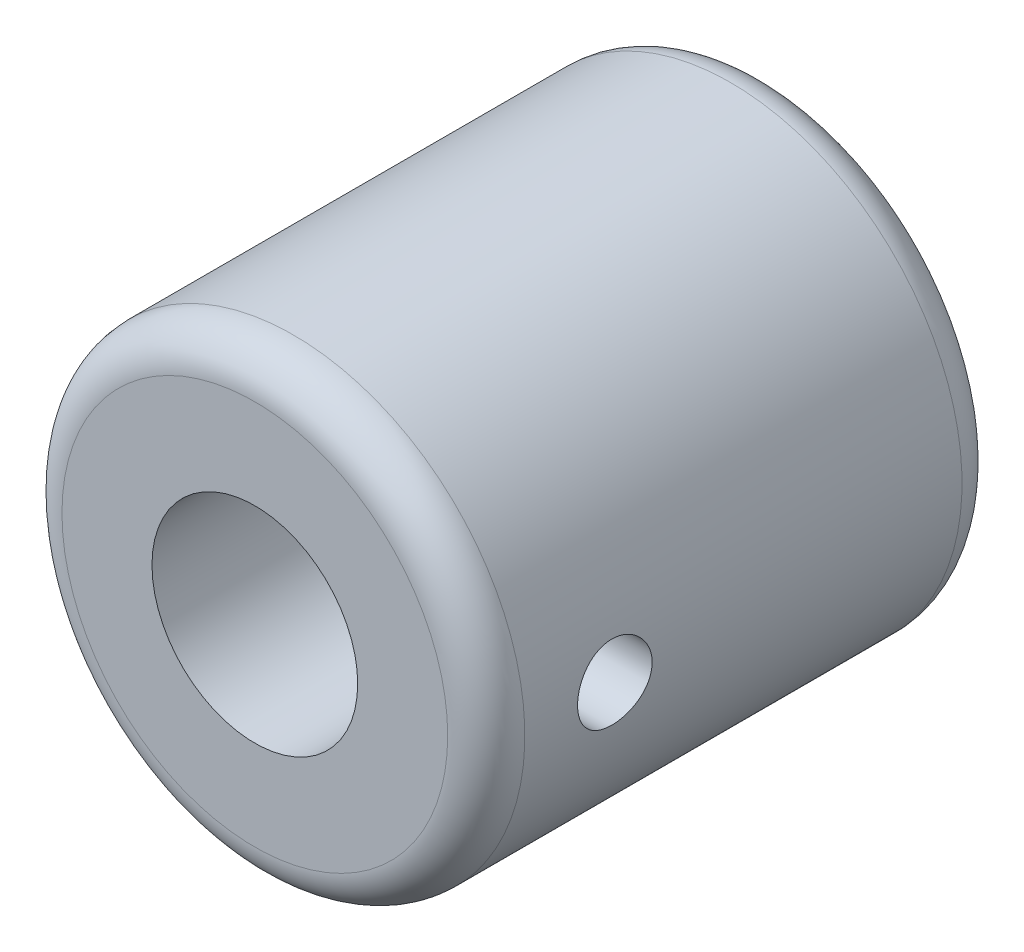
ISO-10303-21;
HEADER;
FILE_DESCRIPTION(('STEP AP214'),'2;1');
FILE_NAME('part.step','',(''),(''),'','','');
FILE_SCHEMA(('AUTOMOTIVE_DESIGN { 1 0 10303 214 1 1 1 1 }'));
ENDSEC;
DATA;
#1=APPLICATION_CONTEXT('core data for automotive mechanical design processes');
#2=APPLICATION_PROTOCOL_DEFINITION('international standard','automotive_design',2000,#1);
#3=PRODUCT_CONTEXT('',#1,'mechanical');
#4=PRODUCT('Part','Part','',(#3));
#5=PRODUCT_RELATED_PRODUCT_CATEGORY('part','',(#4));
#6=PRODUCT_DEFINITION_FORMATION('','',#4);
#7=PRODUCT_DEFINITION_CONTEXT('part definition',#1,'design');
#8=PRODUCT_DEFINITION('design','',#6,#7);
#9=PRODUCT_DEFINITION_SHAPE('','',#8);
#10=(LENGTH_UNIT() NAMED_UNIT(*) SI_UNIT(.MILLI.,.METRE.));
#11=(NAMED_UNIT(*) PLANE_ANGLE_UNIT() SI_UNIT($,.RADIAN.));
#12=(NAMED_UNIT(*) SI_UNIT($,.STERADIAN.) SOLID_ANGLE_UNIT());
#13=UNCERTAINTY_MEASURE_WITH_UNIT(LENGTH_MEASURE(1.E-05),#10,'distance_accuracy_value','');
#14=(GEOMETRIC_REPRESENTATION_CONTEXT(3) GLOBAL_UNCERTAINTY_ASSIGNED_CONTEXT((#13)) GLOBAL_UNIT_ASSIGNED_CONTEXT((#10,
#11,#12)) REPRESENTATION_CONTEXT('',''));
#15=CARTESIAN_POINT('',(0.,0.,0.));
#16=DIRECTION('',(0.,0.,1.));
#17=DIRECTION('',(1.,0.,0.));
#18=AXIS2_PLACEMENT_3D('',#15,#16,#17);
#19=CARTESIAN_POINT('',(0.,0.,18.5));
#20=DIRECTION('',(0.,0.,-1.));
#21=DIRECTION('',(-1.,0.,0.));
#22=AXIS2_PLACEMENT_3D('',#19,#20,#21);
#23=TOROIDAL_SURFACE('',#22,7.5,1.5);
#24=CARTESIAN_POINT('',(0.,0.,20.));
#25=DIRECTION('',(0.,0.,-1.));
#26=DIRECTION('',(-1.,0.,0.));
#27=AXIS2_PLACEMENT_3D('',#24,#25,#26);
#28=CIRCLE('',#27,7.5);
#29=CARTESIAN_POINT('',(-7.5,0.,20.));
#30=VERTEX_POINT('',#29);
#31=EDGE_CURVE('E42',#30,#30,#28,.T.);
#32=ORIENTED_EDGE('',*,*,#31,.T.);
#33=EDGE_LOOP('',(#32));
#34=FACE_BOUND('',#33,.T.);
#35=CARTESIAN_POINT('',(0.,0.,18.5));
#36=DIRECTION('',(0.,0.,-1.));
#37=DIRECTION('',(-1.,0.,0.));
#38=AXIS2_PLACEMENT_3D('',#35,#36,#37);
#39=CIRCLE('',#38,9.);
#40=CARTESIAN_POINT('',(-9.,0.,18.5));
#41=VERTEX_POINT('',#40);
#42=EDGE_CURVE('E55',#41,#41,#39,.T.);
#43=ORIENTED_EDGE('',*,*,#42,.F.);
#44=EDGE_LOOP('',(#43));
#45=FACE_BOUND('',#44,.T.);
#46=ADVANCED_FACE('F31',(#34,#45),#23,.T.);
#47=CARTESIAN_POINT('',(7.5,0.,20.));
#48=DIRECTION('',(0.,0.,1.));
#49=DIRECTION('',(1.,0.,0.));
#50=AXIS2_PLACEMENT_3D('',#47,#48,#49);
#51=PLANE('',#50);
#52=CARTESIAN_POINT('',(0.,0.,20.));
#53=DIRECTION('',(0.,0.,1.));
#54=DIRECTION('',(1.,0.,0.));
#55=AXIS2_PLACEMENT_3D('',#52,#53,#54);
#56=CIRCLE('',#55,3.99999999999999);
#57=CARTESIAN_POINT('',(3.99999999999999,0.,20.));
#58=VERTEX_POINT('',#57);
#59=EDGE_CURVE('E61',#58,#58,#56,.T.);
#60=ORIENTED_EDGE('',*,*,#59,.F.);
#61=EDGE_LOOP('',(#60));
#62=FACE_BOUND('',#61,.T.);
#63=ORIENTED_EDGE('',*,*,#31,.F.);
#64=EDGE_LOOP('',(#63));
#65=FACE_BOUND('',#64,.T.);
#66=ADVANCED_FACE('F91',(#62,#65),#51,.T.);
#67=CARTESIAN_POINT('',(0.,0.,0.));
#68=DIRECTION('',(0.,0.,-1.));
#69=DIRECTION('',(-1.,0.,0.));
#70=AXIS2_PLACEMENT_3D('',#67,#68,#69);
#71=PLANE('',#70);
#72=CARTESIAN_POINT('',(0.,0.,0.));
#73=DIRECTION('',(0.,0.,-1.));
#74=DIRECTION('',(-1.,0.,0.));
#75=AXIS2_PLACEMENT_3D('',#72,#73,#74);
#76=CIRCLE('',#75,7.5);
#77=CARTESIAN_POINT('',(-7.5,0.,0.));
#78=VERTEX_POINT('',#77);
#79=EDGE_CURVE('E46',#78,#78,#76,.T.);
#80=ORIENTED_EDGE('',*,*,#79,.T.);
#81=EDGE_LOOP('',(#80));
#82=FACE_BOUND('',#81,.T.);
#83=ADVANCED_FACE('F95',(#82),#71,.T.);
#84=CARTESIAN_POINT('',(0.,0.,1.5));
#85=DIRECTION('',(0.,0.,-1.));
#86=DIRECTION('',(-1.,0.,0.));
#87=AXIS2_PLACEMENT_3D('',#84,#85,#86);
#88=TOROIDAL_SURFACE('',#87,7.5,1.5);
#89=CARTESIAN_POINT('',(0.,0.,1.5));
#90=DIRECTION('',(0.,0.,-1.));
#91=DIRECTION('',(-1.,0.,0.));
#92=AXIS2_PLACEMENT_3D('',#89,#90,#91);
#93=CIRCLE('',#92,9.);
#94=CARTESIAN_POINT('',(-9.,0.,1.5));
#95=VERTEX_POINT('',#94);
#96=EDGE_CURVE('E50',#95,#95,#93,.T.);
#97=ORIENTED_EDGE('',*,*,#96,.T.);
#98=EDGE_LOOP('',(#97));
#99=FACE_BOUND('',#98,.T.);
#100=ORIENTED_EDGE('',*,*,#79,.F.);
#101=EDGE_LOOP('',(#100));
#102=FACE_BOUND('',#101,.T.);
#103=ADVANCED_FACE('F88',(#99,#102),#88,.T.);
#104=CARTESIAN_POINT('',(0.,0.,20.));
#105=DIRECTION('',(0.,0.,-1.));
#106=DIRECTION('',(-1.,0.,0.));
#107=AXIS2_PLACEMENT_3D('',#104,#105,#106);
#108=CYLINDRICAL_SURFACE('',#107,9.);
#109=CARTESIAN_POINT('',(9.,0.,16.45));
#110=CARTESIAN_POINT('',(8.99999864163477,-0.0808856973678512,16.4499967234144));
#111=CARTESIAN_POINT('',(8.99889820188385,-0.161816502307171,16.4432090421148));
#112=CARTESIAN_POINT('',(8.99461427607327,-0.321410915033058,16.4162474238349));
#113=CARTESIAN_POINT('',(8.99142883568083,-0.400072323350602,16.3960609274988));
#114=CARTESIAN_POINT('',(8.98333243334627,-0.552795622571259,16.3429247761248));
#115=CARTESIAN_POINT('',(8.97842284636489,-0.626861123368278,16.3099852891171));
#116=CARTESIAN_POINT('',(8.96741889784965,-0.768403758298809,16.2323042124315));
#117=CARTESIAN_POINT('',(8.96132468180079,-0.835881699927264,16.1875640717583));
#118=CARTESIAN_POINT('',(8.94856673883706,-0.962948382041978,16.0871250823013));
#119=CARTESIAN_POINT('',(8.94189883817951,-1.02246954424322,16.0313412604146));
#120=CARTESIAN_POINT('',(8.92877723275232,-1.1313495692762,15.9105812988802));
#121=CARTESIAN_POINT('',(8.92232354109868,-1.18070781079302,15.8456045976309));
#122=CARTESIAN_POINT('',(8.91032062687366,-1.26812908144996,15.7078425636774));
#123=CARTESIAN_POINT('',(8.90477679815245,-1.30612577634167,15.6350146255892));
#124=CARTESIAN_POINT('',(8.89527890726653,-1.36932126901981,15.4839058843686));
#125=CARTESIAN_POINT('',(8.89132474492388,-1.39452087328236,15.4056254252092));
#126=CARTESIAN_POINT('',(8.88549527203012,-1.43119497399201,15.2465482096226));
#127=CARTESIAN_POINT('',(8.88360234985213,-1.44278581414222,15.1657789328401));
#128=CARTESIAN_POINT('',(8.8820563424505,-1.45227398597366,15.0034214036398));
#129=CARTESIAN_POINT('',(8.88240310906643,-1.45017222345114,14.921833205752));
#130=CARTESIAN_POINT('',(8.88528121037884,-1.43242972412221,14.7609813508911));
#131=CARTESIAN_POINT('',(8.88779151853047,-1.41691929604862,14.6817028896378));
#132=CARTESIAN_POINT('',(8.89468096456813,-1.37300407180314,14.5268884917858));
#133=CARTESIAN_POINT('',(8.8990601627026,-1.3445988599332,14.4513526759284));
#134=CARTESIAN_POINT('',(8.90921685418146,-1.27556710019611,14.3057754577108));
#135=CARTESIAN_POINT('',(8.91500055833395,-1.23488606848856,14.2357603423395));
#136=CARTESIAN_POINT('',(8.92731021295221,-1.14249617763677,14.1035007691039));
#137=CARTESIAN_POINT('',(8.93383621946084,-1.09078648558466,14.0412568987039));
#138=CARTESIAN_POINT('',(8.94698773076978,-0.977095309189443,13.9255520775868));
#139=CARTESIAN_POINT('',(8.95361351338076,-0.915001940862871,13.8722010341061));
#140=CARTESIAN_POINT('',(8.96614813756879,-0.782685420070299,13.7766593221192));
#141=CARTESIAN_POINT('',(8.97205697507046,-0.712462221395631,13.7344687170517));
#142=CARTESIAN_POINT('',(8.9824995419863,-0.56577886267247,13.662437021556));
#143=CARTESIAN_POINT('',(8.98703223682215,-0.489314064742299,13.63260521631));
#144=CARTESIAN_POINT('',(8.9942033907472,-0.332370368449594,13.5862377057025));
#145=CARTESIAN_POINT('',(8.99684199778981,-0.251891784142396,13.569700961808));
#146=CARTESIAN_POINT('',(8.99990788531399,-0.090152743447503,13.5505410025793));
#147=CARTESIAN_POINT('',(9.0003591564028,-0.00891060812457302,13.5477668319632));
#148=CARTESIAN_POINT('',(8.99906509532078,0.152877988086236,13.5558089253652));
#149=CARTESIAN_POINT('',(8.99731984194802,0.233424473825462,13.5666247018579));
#150=CARTESIAN_POINT('',(8.99184367572178,0.391072188867861,13.6014141197314));
#151=CARTESIAN_POINT('',(8.98812398290452,0.468190243474586,13.6253134358321));
#152=CARTESIAN_POINT('',(8.97911444477737,0.617324972735382,13.6855125803072));
#153=CARTESIAN_POINT('',(8.97382451615702,0.689341376464928,13.7218130666539));
#154=CARTESIAN_POINT('',(8.96220213122442,0.826887014248257,13.8061327443032));
#155=CARTESIAN_POINT('',(8.95586138334354,0.892357419344891,13.8542467351865));
#156=CARTESIAN_POINT('',(8.9428668457303,1.01434858455787,13.9606966946547));
#157=CARTESIAN_POINT('',(8.93621303486055,1.07086873924295,14.0190333541808));
#158=CARTESIAN_POINT('',(8.92326523772599,1.17391103158433,14.1449480249811));
#159=CARTESIAN_POINT('',(8.91697534238602,1.22033144783824,14.2126097661866));
#160=CARTESIAN_POINT('',(8.90554257529543,1.30114730089954,14.3548592848618));
#161=CARTESIAN_POINT('',(8.90039966895979,1.33554310030164,14.4294468534017));
#162=CARTESIAN_POINT('',(8.89187351088456,1.39117930258979,14.5831398355927));
#163=CARTESIAN_POINT('',(8.88848336189528,1.41247133391357,14.6622261601934));
#164=CARTESIAN_POINT('',(8.88382890168131,1.44145873215246,14.8229115492917));
#165=CARTESIAN_POINT('',(8.8825644188798,1.44915519645985,14.9045104104441));
#166=CARTESIAN_POINT('',(8.88231151925494,1.45070392455936,15.0668894935775));
#167=CARTESIAN_POINT('',(8.88329678925587,1.44471623787206,15.1476681930062));
#168=CARTESIAN_POINT('',(8.88737487767908,1.41941164318996,15.3070531292623));
#169=CARTESIAN_POINT('',(8.89046769052656,1.40009477045305,15.3856593718356));
#170=CARTESIAN_POINT('',(8.89840265721009,1.34873984861122,15.5384121850153));
#171=CARTESIAN_POINT('',(8.90324303796602,1.31671469006406,15.6125631872757));
#172=CARTESIAN_POINT('',(8.91412961190141,1.24086851755457,15.754465757622));
#173=CARTESIAN_POINT('',(8.92017585841292,1.19704698184171,15.8222170424712));
#174=CARTESIAN_POINT('',(8.93287673735512,1.0982772134197,15.9502071827237));
#175=CARTESIAN_POINT('',(8.93953737432156,1.04321095049666,16.0103543707792));
#176=CARTESIAN_POINT('',(8.95266789166719,0.923764066193607,16.1206100315023));
#177=CARTESIAN_POINT('',(8.9591377275746,0.859381293663331,16.1707161793384));
#178=CARTESIAN_POINT('',(8.97120553613006,0.722639750859127,16.2597590227404));
#179=CARTESIAN_POINT('',(8.97679765153614,0.65023247909754,16.298622029143));
#180=CARTESIAN_POINT('',(8.98642284134844,0.499858635602071,16.363574516705));
#181=CARTESIAN_POINT('',(8.99045748906061,0.421897768767406,16.3896768953991));
#182=CARTESIAN_POINT('',(8.99561866396827,0.286347832230081,16.4226129534629));
#183=CARTESIAN_POINT('',(8.99725300228573,0.229584761453284,16.4328669097724));
#184=CARTESIAN_POINT('',(8.99944414581359,0.115222082591754,16.4465615474572));
#185=CARTESIAN_POINT('',(9.00000096769127,0.0576224874604528,16.45000233422));
#186=CARTESIAN_POINT('',(9.,0.,16.45));
#187=B_SPLINE_CURVE_WITH_KNOTS('',3,(#109,#110,#111,#112,#113,#114,#115,#116,#117,#118,#119,
#120,#121,#122,#123,#124,#125,#126,#127,#128,#129,#130,#131,#132,#133,#134,#135,#136,#137,#138,
#139,#140,#141,#142,#143,#144,#145,#146,#147,#148,#149,#150,#151,#152,#153,#154,#155,#156,#157,
#158,#159,#160,#161,#162,#163,#164,#165,#166,#167,#168,#169,#170,#171,#172,#173,#174,#175,#176,
#177,#178,#179,#180,#181,#182,#183,#184,#185,#186),.UNSPECIFIED.,.T.,.F.,(4,2,2,2,2,2,2,2,2,2,2,
2,2,2,2,2,2,2,2,2,2,2,2,2,2,2,2,2,2,2,2,2,2,2,2,2,2,2,4),(0.,0.242446488977201,
0.485120556285424,0.727601535351912,0.970052753977684,1.2144475309955,1.45885724476858,
1.70466726356049,1.95046178941547,2.19413931011524,2.43780071116673,2.67912043486188,
2.92044793869995,3.16286268760826,3.40529575068034,3.65053273475495,3.89577111278618,
4.14119340605033,4.38659652648819,4.62930188944313,4.87199854584071,5.11333058050699,
5.35467542158247,5.598024186261,5.84138940501282,6.08710259860969,6.33280838224105,
6.57753978919825,6.82225144128793,7.06411562003952,7.30597915902271,7.54759799002884,
7.78922750952607,8.03353728745566,8.27790356595634,8.52383693999688,8.7695212254992,
8.94224132716638,9.11495875713902),.UNSPECIFIED.);
#188=CARTESIAN_POINT('',(9.,0.,16.45));
#189=VERTEX_POINT('',#188);
#190=EDGE_CURVE('E64',#189,#189,#187,.T.);
#191=ORIENTED_EDGE('',*,*,#190,.F.);
#192=EDGE_LOOP('',(#191));
#193=FACE_BOUND('',#192,.T.);
#194=ORIENTED_EDGE('',*,*,#42,.T.);
#195=EDGE_LOOP('',(#194));
#196=FACE_BOUND('',#195,.T.);
#197=ORIENTED_EDGE('',*,*,#96,.F.);
#198=EDGE_LOOP('',(#197));
#199=FACE_BOUND('',#198,.T.);
#200=ADVANCED_FACE('F70',(#193,#196,#199),#108,.T.);
#201=CARTESIAN_POINT('',(0.,0.,10.));
#202=DIRECTION('',(0.,0.,-1.));
#203=DIRECTION('',(-1.,0.,0.));
#204=AXIS2_PLACEMENT_3D('',#201,#202,#203);
#205=PLANE('',#204);
#206=CARTESIAN_POINT('',(0.,0.,10.));
#207=DIRECTION('',(0.,0.,1.));
#208=DIRECTION('',(1.,0.,0.));
#209=AXIS2_PLACEMENT_3D('',#206,#207,#208);
#210=CIRCLE('',#209,3.99999999999999);
#211=CARTESIAN_POINT('',(3.99999999999999,0.,10.));
#212=VERTEX_POINT('',#211);
#213=EDGE_CURVE('E58',#212,#212,#210,.T.);
#214=ORIENTED_EDGE('',*,*,#213,.T.);
#215=EDGE_LOOP('',(#214));
#216=FACE_BOUND('',#215,.T.);
#217=ADVANCED_FACE('F82',(#216),#205,.F.);
#218=CARTESIAN_POINT('',(0.,0.,20.));
#219=DIRECTION('',(0.,0.,1.));
#220=DIRECTION('',(1.,0.,0.));
#221=AXIS2_PLACEMENT_3D('',#218,#219,#220);
#222=CYLINDRICAL_SURFACE('',#221,3.99999999999999);
#223=CARTESIAN_POINT('',(3.99999999999999,0.,13.55));
#224=CARTESIAN_POINT('',(4.00000143429506,0.0787102188966314,13.5499980327237));
#225=CARTESIAN_POINT('',(3.99765615873191,0.15740656061478,13.5564292482891));
#226=CARTESIAN_POINT('',(3.98853365231902,0.312457571109628,13.58188808274));
#227=CARTESIAN_POINT('',(3.98175673206562,0.388812403600801,13.6009148188567));
#228=CARTESIAN_POINT('',(3.96450118916374,0.536922462366692,13.650810273815));
#229=CARTESIAN_POINT('',(3.95402941917062,0.608685914938115,13.6816570796047));
#230=CARTESIAN_POINT('',(3.93043508700043,0.746016803327513,13.7542094318718));
#231=CARTESIAN_POINT('',(3.91731186630475,0.811582693959298,13.7959176766588));
#232=CARTESIAN_POINT('',(3.88918970877765,0.937285118452869,13.8907580494355));
#233=CARTESIAN_POINT('',(3.87414013213587,0.997139891199236,13.9442484858298));
#234=CARTESIAN_POINT('',(3.84411947833008,1.10725279772524,14.0603740029828));
#235=CARTESIAN_POINT('',(3.82914842408004,1.15750826699459,14.1230116142644));
#236=CARTESIAN_POINT('',(3.80040087939938,1.24872957377566,14.2583385895047));
#237=CARTESIAN_POINT('',(3.7866847759132,1.28930735425139,14.3313036332209));
#238=CARTESIAN_POINT('',(3.76278248881607,1.357491470763,14.4835989089086));
#239=CARTESIAN_POINT('',(3.75259500060562,1.38510260217423,14.5629267750294));
#240=CARTESIAN_POINT('',(3.73744223418718,1.42547430690299,14.7224627453627));
#241=CARTESIAN_POINT('',(3.73228956305748,1.43876982416804,14.8025171017444));
#242=CARTESIAN_POINT('',(3.7272394630429,1.45180567304113,14.9638736111432));
#243=CARTESIAN_POINT('',(3.7273400425036,1.45155114185127,15.0451752795824));
#244=CARTESIAN_POINT('',(3.7326226740955,1.43790508960838,15.2019322401092));
#245=CARTESIAN_POINT('',(3.73752322645273,1.42524130526233,15.2774620935265));
#246=CARTESIAN_POINT('',(3.75138804868882,1.38833434277264,15.4252413100427));
#247=CARTESIAN_POINT('',(3.7603528901922,1.36408953578304,15.4974902101169));
#248=CARTESIAN_POINT('',(3.78151508931446,1.30428590365612,15.6381921734249));
#249=CARTESIAN_POINT('',(3.79376804732003,1.26853013421167,15.7065527990085));
#250=CARTESIAN_POINT('',(3.82010587581946,1.1868565726519,15.8365207969095));
#251=CARTESIAN_POINT('',(3.83419134797483,1.14093543949722,15.8981259389316));
#252=CARTESIAN_POINT('',(3.86368134619659,1.03685380399281,16.0168823285497));
#253=CARTESIAN_POINT('',(3.87911330363703,0.978107895512852,16.0735148898613));
#254=CARTESIAN_POINT('',(3.90879691295877,0.851770367366738,16.1762729986214));
#255=CARTESIAN_POINT('',(3.92304840628928,0.784177562589416,16.2223971361112));
#256=CARTESIAN_POINT('',(3.94901650226209,0.640811853190586,16.3033515258445));
#257=CARTESIAN_POINT('',(3.96069598677121,0.564940184547798,16.3380196172229));
#258=CARTESIAN_POINT('',(3.97993087107473,0.407913924152238,16.3939311306713));
#259=CARTESIAN_POINT('',(3.98748797738854,0.326761534028094,16.4151801083571));
#260=CARTESIAN_POINT('',(3.99733199343637,0.165850881119846,16.4426775684794));
#261=CARTESIAN_POINT('',(3.99986431835222,0.0862269840630918,16.4496252295282));
#262=CARTESIAN_POINT('',(4.00012487803512,-0.0730793807824156,16.4503449671724));
#263=CARTESIAN_POINT('',(3.99785409609123,-0.152761833245371,16.4441197405132));
#264=CARTESIAN_POINT('',(3.98892574075718,-0.306971769665556,16.4192092040065));
#265=CARTESIAN_POINT('',(3.98242634268281,-0.381581880655492,16.4009728879694));
#266=CARTESIAN_POINT('',(3.9658524677216,-0.526638331560439,16.3531396817656));
#267=CARTESIAN_POINT('',(3.95577752595711,-0.597084128658258,16.3235413143102));
#268=CARTESIAN_POINT('',(3.93269799287488,-0.734065013482931,16.2528993991782));
#269=CARTESIAN_POINT('',(3.91961788794788,-0.800430745978938,16.2115528683167));
#270=CARTESIAN_POINT('',(3.89198705575025,-0.925497470523079,16.1189345902305));
#271=CARTESIAN_POINT('',(3.87743581293793,-0.984195758980481,16.0676593578161));
#272=CARTESIAN_POINT('',(3.8474941879468,-1.09557971967384,15.9533679695239));
#273=CARTESIAN_POINT('',(3.8321010174091,-1.14776796846998,15.8898665312232));
#274=CARTESIAN_POINT('',(3.80298761939567,-1.24083444907402,15.754693741563));
#275=CARTESIAN_POINT('',(3.78926749248273,-1.28171200120929,15.6830218996));
#276=CARTESIAN_POINT('',(3.76514010385445,-1.3509531698889,15.5331500076326));
#277=CARTESIAN_POINT('',(3.75473924877078,-1.37929262648282,15.4549376963146));
#278=CARTESIAN_POINT('',(3.73868905158301,-1.42223058341666,15.294373796911));
#279=CARTESIAN_POINT('',(3.73303702926071,-1.4368368352658,15.2120245715328));
#280=CARTESIAN_POINT('',(3.72746504538524,-1.45122640814096,15.0508739973767));
#281=CARTESIAN_POINT('',(3.7272198640188,-1.45185077279353,14.9721583024371));
#282=CARTESIAN_POINT('',(3.73166466892373,-1.44038737859729,14.8158075591342));
#283=CARTESIAN_POINT('',(3.73635424771031,-1.42830066935764,14.7381724220808));
#284=CARTESIAN_POINT('',(3.74987786633439,-1.39239595048802,14.5882738229403));
#285=CARTESIAN_POINT('',(3.75859821711893,-1.36889890664494,14.515922369653));
#286=CARTESIAN_POINT('',(3.77914169092129,-1.31111547378808,14.3761412953731));
#287=CARTESIAN_POINT('',(3.79096557226788,-1.27682644741102,14.3087128824493));
#288=CARTESIAN_POINT('',(3.81711771948605,-1.19644513556002,14.177040847293));
#289=CARTESIAN_POINT('',(3.83154144962497,-1.14984964568511,14.1131235727399));
#290=CARTESIAN_POINT('',(3.86091879905901,-1.04697882292614,13.9937455069048));
#291=CARTESIAN_POINT('',(3.87587257990626,-0.990700518358087,13.9382873216286));
#292=CARTESIAN_POINT('',(3.90550898759356,-0.86674652175496,13.8346282178496));
#293=CARTESIAN_POINT('',(3.92014206041407,-0.79864625558554,13.7869187144231));
#294=CARTESIAN_POINT('',(3.94670230500471,-0.654887277166559,13.7036510176979));
#295=CARTESIAN_POINT('',(3.95862956169155,-0.579228802223837,13.6680924430486));
#296=CARTESIAN_POINT('',(3.97857109220644,-0.421194621236146,13.6099313342799));
#297=CARTESIAN_POINT('',(3.98652096811409,-0.338732079278765,13.5875410540631));
#298=CARTESIAN_POINT('',(3.99723355206213,-0.170840068367129,13.557579573305));
#299=CARTESIAN_POINT('',(3.99999844358435,-0.085411863745633,13.5500021347766));
#300=CARTESIAN_POINT('',(3.99999999999999,0.,13.55));
#301=B_SPLINE_CURVE_WITH_KNOTS('',3,(#223,#224,#225,#226,#227,#228,#229,#230,#231,#232,#233,
#234,#235,#236,#237,#238,#239,#240,#241,#242,#243,#244,#245,#246,#247,#248,#249,#250,#251,#252,
#253,#254,#255,#256,#257,#258,#259,#260,#261,#262,#263,#264,#265,#266,#267,#268,#269,#270,#271,
#272,#273,#274,#275,#276,#277,#278,#279,#280,#281,#282,#283,#284,#285,#286,#287,#288,#289,#290,
#291,#292,#293,#294,#295,#296,#297,#298,#299,#300),.UNSPECIFIED.,.T.,.F.,(4,2,2,2,2,2,2,2,2,2,2,
2,2,2,2,2,2,2,2,2,2,2,2,2,2,2,2,2,2,2,2,2,2,2,2,2,2,2,4),(0.,0.235815830831914,
0.471615136041732,0.706979394974226,0.9424021813736,1.18633103053023,1.43032748974055,
1.68288966606066,1.93535836517963,2.1780251356637,2.42059990504772,2.64975139405899,
2.87893512222926,3.11226934704531,3.34568037574028,3.59367330938501,3.84169949769452,
4.09309949254543,4.34439533752189,4.58308195035425,4.82171970414022,5.05190772695761,
5.2821256888575,5.51892461059922,5.75580680508056,6.00551088108391,6.25522995883228,
6.50542815237797,6.7554850402368,6.99045716940948,7.2254098974257,7.45410602635341,
7.68285808788833,7.92301401090669,8.16324377037918,8.41529497370839,8.66733826581303,
8.92334005666771,9.17923401674589),.UNSPECIFIED.);
#302=CARTESIAN_POINT('',(3.99999999999999,0.,13.55));
#303=VERTEX_POINT('',#302);
#304=EDGE_CURVE('E10',#303,#303,#301,.T.);
#305=ORIENTED_EDGE('',*,*,#304,.T.);
#306=EDGE_LOOP('',(#305));
#307=FACE_BOUND('',#306,.T.);
#308=ORIENTED_EDGE('',*,*,#213,.F.);
#309=EDGE_LOOP('',(#308));
#310=FACE_BOUND('',#309,.T.);
#311=ORIENTED_EDGE('',*,*,#59,.T.);
#312=EDGE_LOOP('',(#311));
#313=FACE_BOUND('',#312,.T.);
#314=ADVANCED_FACE('F77',(#307,#310,#313),#222,.F.);
#315=CARTESIAN_POINT('',(3.72793508527174,0.,15.));
#316=DIRECTION('',(-1.,0.,0.));
#317=DIRECTION('',(0.,0.,1.));
#318=AXIS2_PLACEMENT_3D('',#315,#316,#317);
#319=CYLINDRICAL_SURFACE('',#318,1.44999999999999);
#320=ORIENTED_EDGE('',*,*,#190,.T.);
#321=EDGE_LOOP('',(#320));
#322=FACE_BOUND('',#321,.T.);
#323=ORIENTED_EDGE('',*,*,#304,.F.);
#324=EDGE_LOOP('',(#323));
#325=FACE_BOUND('',#324,.T.);
#326=ADVANCED_FACE('F74',(#322,#325),#319,.F.);
#327=CLOSED_SHELL('',(#46,#66,#83,#103,#200,#217,#314,#326));
#328=MANIFOLD_SOLID_BREP('B2',#327);
#329=ADVANCED_BREP_SHAPE_REPRESENTATION('',(#18,#328),#14);
#330=SHAPE_DEFINITION_REPRESENTATION(#9,#329);
ENDSEC;
END-ISO-10303-21;
